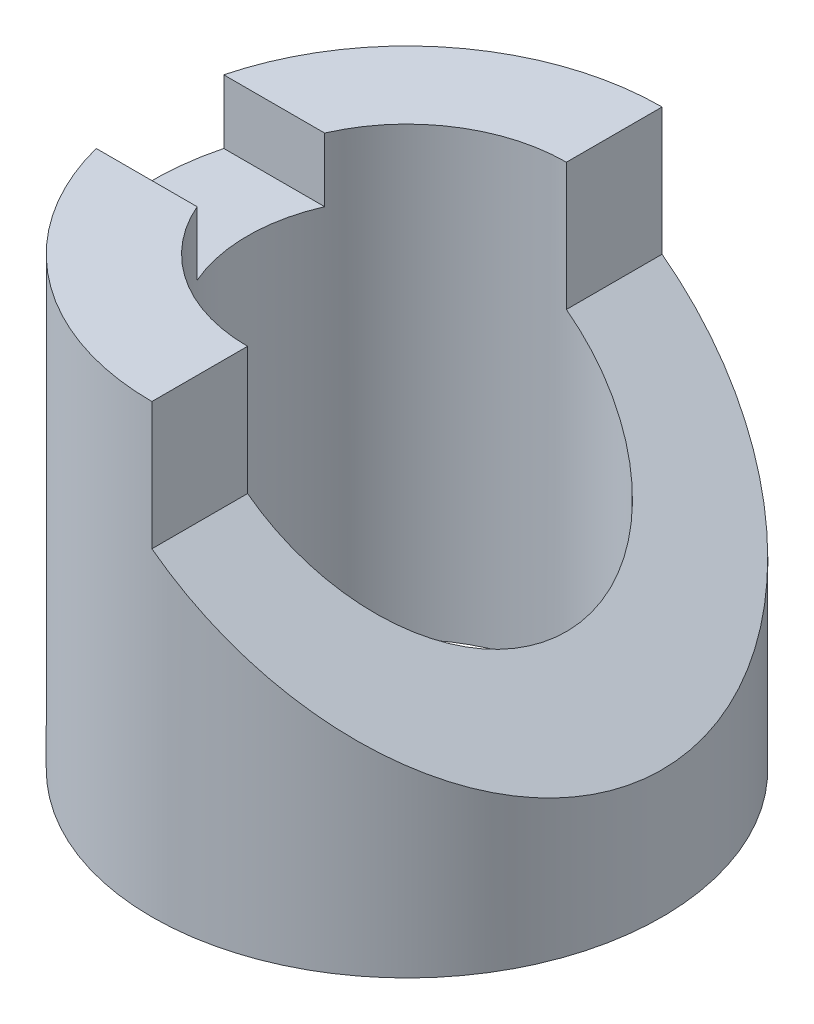
ISO-10303-21;
HEADER;
FILE_DESCRIPTION(('STEP AP214'),'2;1');
FILE_NAME('part.step','',(''),(''),'','','');
FILE_SCHEMA(('AUTOMOTIVE_DESIGN { 1 0 10303 214 1 1 1 1 }'));
ENDSEC;
DATA;
#1=APPLICATION_CONTEXT('core data for automotive mechanical design processes');
#2=APPLICATION_PROTOCOL_DEFINITION('international standard','automotive_design',2000,#1);
#3=PRODUCT_CONTEXT('',#1,'mechanical');
#4=PRODUCT('Part','Part','',(#3));
#5=PRODUCT_RELATED_PRODUCT_CATEGORY('part','',(#4));
#6=PRODUCT_DEFINITION_FORMATION('','',#4);
#7=PRODUCT_DEFINITION_CONTEXT('part definition',#1,'design');
#8=PRODUCT_DEFINITION('design','',#6,#7);
#9=PRODUCT_DEFINITION_SHAPE('','',#8);
#10=(LENGTH_UNIT() NAMED_UNIT(*) SI_UNIT(.MILLI.,.METRE.));
#11=(NAMED_UNIT(*) PLANE_ANGLE_UNIT() SI_UNIT($,.RADIAN.));
#12=(NAMED_UNIT(*) SI_UNIT($,.STERADIAN.) SOLID_ANGLE_UNIT());
#13=UNCERTAINTY_MEASURE_WITH_UNIT(LENGTH_MEASURE(1.E-05),#10,'distance_accuracy_value','');
#14=(GEOMETRIC_REPRESENTATION_CONTEXT(3) GLOBAL_UNCERTAINTY_ASSIGNED_CONTEXT((#13)) GLOBAL_UNIT_ASSIGNED_CONTEXT((#10,
#11,#12)) REPRESENTATION_CONTEXT('',''));
#15=CARTESIAN_POINT('',(0.,0.,0.));
#16=DIRECTION('',(0.,0.,1.));
#17=DIRECTION('',(1.,0.,0.));
#18=AXIS2_PLACEMENT_3D('',#15,#16,#17);
#19=CARTESIAN_POINT('',(0.,70.,0.));
#20=DIRECTION('',(0.,1.,0.));
#21=DIRECTION('',(0.,0.,1.));
#22=AXIS2_PLACEMENT_3D('',#19,#20,#21);
#23=PLANE('',#22);
#24=CARTESIAN_POINT('',(0.,70.,0.));
#25=DIRECTION('',(0.,1.,0.));
#26=DIRECTION('',(0.,0.,1.));
#27=AXIS2_PLACEMENT_3D('',#24,#25,#26);
#28=CIRCLE('',#27,40.);
#29=CARTESIAN_POINT('',(0.,70.,-40.));
#30=VERTEX_POINT('',#29);
#31=CARTESIAN_POINT('',(-38.7298334620742,70.,-10.));
#32=VERTEX_POINT('',#31);
#33=EDGE_CURVE('E119',#30,#32,#28,.T.);
#34=ORIENTED_EDGE('',*,*,#33,.T.);
#35=DIRECTION('',(1.,0.,0.));
#36=VECTOR('',#35,1.);
#37=CARTESIAN_POINT('',(-70.,70.,-10.));
#38=LINE('',#37,#36);
#39=CARTESIAN_POINT('',(-22.9128784747792,70.,-10.));
#40=VERTEX_POINT('',#39);
#41=EDGE_CURVE('E105',#32,#40,#38,.T.);
#42=ORIENTED_EDGE('',*,*,#41,.T.);
#43=CARTESIAN_POINT('',(0.,70.,0.));
#44=DIRECTION('',(0.,1.,0.));
#45=DIRECTION('',(0.,0.,1.));
#46=AXIS2_PLACEMENT_3D('',#43,#44,#45);
#47=CIRCLE('',#46,25.);
#48=CARTESIAN_POINT('',(0.,70.,-25.));
#49=VERTEX_POINT('',#48);
#50=EDGE_CURVE('E125',#49,#40,#47,.T.);
#51=ORIENTED_EDGE('',*,*,#50,.F.);
#52=DIRECTION('',(0.,0.,-1.));
#53=VECTOR('',#52,1.);
#54=CARTESIAN_POINT('',(0.,70.,70.));
#55=LINE('',#54,#53);
#56=EDGE_CURVE('E161',#49,#30,#55,.T.);
#57=ORIENTED_EDGE('',*,*,#56,.T.);
#58=EDGE_LOOP('',(#34,#42,#51,#57));
#59=FACE_BOUND('',#58,.T.);
#60=ADVANCED_FACE('F33',(#59),#23,.T.);
#61=CARTESIAN_POINT('',(-22.9128784747792,70.,10.));
#62=VERTEX_POINT('',#61);
#63=CARTESIAN_POINT('',(0.,70.,25.));
#64=VERTEX_POINT('',#63);
#65=EDGE_CURVE('E113',#62,#64,#47,.T.);
#66=ORIENTED_EDGE('',*,*,#65,.F.);
#67=DIRECTION('',(1.,0.,0.));
#68=VECTOR('',#67,1.);
#69=CARTESIAN_POINT('',(-70.,70.,10.));
#70=LINE('',#69,#68);
#71=CARTESIAN_POINT('',(-38.7298334620742,70.,10.));
#72=VERTEX_POINT('',#71);
#73=EDGE_CURVE('E48',#72,#62,#70,.T.);
#74=ORIENTED_EDGE('',*,*,#73,.F.);
#75=CARTESIAN_POINT('',(0.,70.,40.));
#76=VERTEX_POINT('',#75);
#77=EDGE_CURVE('E111',#72,#76,#28,.T.);
#78=ORIENTED_EDGE('',*,*,#77,.T.);
#79=EDGE_CURVE('E164',#76,#64,#55,.T.);
#80=ORIENTED_EDGE('',*,*,#79,.T.);
#81=EDGE_LOOP('',(#66,#74,#78,#80));
#82=FACE_BOUND('',#81,.T.);
#83=ADVANCED_FACE('F109',(#82),#23,.T.);
#84=CARTESIAN_POINT('',(0.,70.,0.));
#85=DIRECTION('',(0.,-1.,0.));
#86=DIRECTION('',(0.,0.,-1.));
#87=AXIS2_PLACEMENT_3D('',#84,#85,#86);
#88=CYLINDRICAL_SURFACE('',#87,40.);
#89=CARTESIAN_POINT('',(0.,0.,0.));
#90=DIRECTION('',(0.,1.,0.));
#91=DIRECTION('',(0.,0.,1.));
#92=AXIS2_PLACEMENT_3D('',#89,#90,#91);
#93=CIRCLE('',#92,40.);
#94=CARTESIAN_POINT('',(0.,0.,40.));
#95=VERTEX_POINT('',#94);
#96=EDGE_CURVE('E120',#95,#95,#93,.T.);
#97=ORIENTED_EDGE('',*,*,#96,.T.);
#98=EDGE_LOOP('',(#97));
#99=FACE_BOUND('',#98,.T.);
#100=DIRECTION('',(0.,-1.,0.));
#101=VECTOR('',#100,1.);
#102=CARTESIAN_POINT('',(-38.7298334620742,70.,-10.));
#103=LINE('',#102,#101);
#104=CARTESIAN_POINT('',(-38.7298334620742,60.,-10.));
#105=VERTEX_POINT('',#104);
#106=EDGE_CURVE('E152',#32,#105,#103,.T.);
#107=ORIENTED_EDGE('',*,*,#106,.F.);
#108=ORIENTED_EDGE('',*,*,#33,.F.);
#109=DIRECTION('',(0.,-1.,0.));
#110=VECTOR('',#109,1.);
#111=CARTESIAN_POINT('',(0.,70.,-40.));
#112=LINE('',#111,#110);
#113=CARTESIAN_POINT('',(0.,50.,-40.));
#114=VERTEX_POINT('',#113);
#115=EDGE_CURVE('E167',#114,#30,#112,.F.);
#116=ORIENTED_EDGE('',*,*,#115,.F.);
#117=CARTESIAN_POINT('',(0.,50.,0.));
#118=DIRECTION('',(0.6,0.8,0.));
#119=DIRECTION('',(0.8,-0.6,0.));
#120=AXIS2_PLACEMENT_3D('',#117,#118,#119);
#121=ELLIPSE('',#120,50.,40.);
#122=CARTESIAN_POINT('',(0.,50.,40.));
#123=VERTEX_POINT('',#122);
#124=EDGE_CURVE('E165',#123,#114,#121,.T.);
#125=ORIENTED_EDGE('',*,*,#124,.F.);
#126=DIRECTION('',(0.,-1.,0.));
#127=VECTOR('',#126,1.);
#128=CARTESIAN_POINT('',(0.,70.,40.));
#129=LINE('',#128,#127);
#130=EDGE_CURVE('E118',#76,#123,#129,.T.);
#131=ORIENTED_EDGE('',*,*,#130,.F.);
#132=ORIENTED_EDGE('',*,*,#77,.F.);
#133=DIRECTION('',(0.,-1.,0.));
#134=VECTOR('',#133,1.);
#135=CARTESIAN_POINT('',(-38.7298334620742,70.,10.));
#136=LINE('',#135,#134);
#137=CARTESIAN_POINT('',(-38.7298334620742,60.,10.));
#138=VERTEX_POINT('',#137);
#139=EDGE_CURVE('E97',#138,#72,#136,.F.);
#140=ORIENTED_EDGE('',*,*,#139,.F.);
#141=CARTESIAN_POINT('',(0.,60.,0.));
#142=DIRECTION('',(0.,1.,0.));
#143=DIRECTION('',(0.,0.,1.));
#144=AXIS2_PLACEMENT_3D('',#141,#142,#143);
#145=CIRCLE('',#144,40.);
#146=EDGE_CURVE('E104',#105,#138,#145,.T.);
#147=ORIENTED_EDGE('',*,*,#146,.F.);
#148=EDGE_LOOP('',(#107,#108,#116,#125,#131,#132,#140,#147));
#149=FACE_BOUND('',#148,.T.);
#150=ADVANCED_FACE('F35',(#99,#149),#88,.T.);
#151=CARTESIAN_POINT('',(0.,70.,0.));
#152=DIRECTION('',(0.,-1.,0.));
#153=DIRECTION('',(0.,0.,-1.));
#154=AXIS2_PLACEMENT_3D('',#151,#152,#153);
#155=CYLINDRICAL_SURFACE('',#154,25.);
#156=CARTESIAN_POINT('',(0.,0.,0.));
#157=DIRECTION('',(0.,1.,0.));
#158=DIRECTION('',(0.,0.,1.));
#159=AXIS2_PLACEMENT_3D('',#156,#157,#158);
#160=CIRCLE('',#159,25.);
#161=CARTESIAN_POINT('',(0.,0.,25.));
#162=VERTEX_POINT('',#161);
#163=EDGE_CURVE('E128',#162,#162,#160,.T.);
#164=ORIENTED_EDGE('',*,*,#163,.F.);
#165=EDGE_LOOP('',(#164));
#166=FACE_BOUND('',#165,.T.);
#167=ORIENTED_EDGE('',*,*,#50,.T.);
#168=DIRECTION('',(0.,-1.,0.));
#169=VECTOR('',#168,1.);
#170=CARTESIAN_POINT('',(-22.9128784747792,70.,-10.));
#171=LINE('',#170,#169);
#172=CARTESIAN_POINT('',(-22.9128784747792,60.,-10.));
#173=VERTEX_POINT('',#172);
#174=EDGE_CURVE('E11',#40,#173,#171,.T.);
#175=ORIENTED_EDGE('',*,*,#174,.T.);
#176=CARTESIAN_POINT('',(0.,60.,0.));
#177=DIRECTION('',(0.,1.,0.));
#178=DIRECTION('',(0.,0.,1.));
#179=AXIS2_PLACEMENT_3D('',#176,#177,#178);
#180=CIRCLE('',#179,25.);
#181=CARTESIAN_POINT('',(-22.9128784747792,60.,10.));
#182=VERTEX_POINT('',#181);
#183=EDGE_CURVE('E41',#173,#182,#180,.T.);
#184=ORIENTED_EDGE('',*,*,#183,.T.);
#185=DIRECTION('',(0.,-1.,0.));
#186=VECTOR('',#185,1.);
#187=CARTESIAN_POINT('',(-22.9128784747792,70.,10.));
#188=LINE('',#187,#186);
#189=EDGE_CURVE('E139',#182,#62,#188,.F.);
#190=ORIENTED_EDGE('',*,*,#189,.T.);
#191=ORIENTED_EDGE('',*,*,#65,.T.);
#192=DIRECTION('',(0.,-1.,0.));
#193=VECTOR('',#192,1.);
#194=CARTESIAN_POINT('',(0.,70.,25.));
#195=LINE('',#194,#193);
#196=CARTESIAN_POINT('',(0.,50.,25.));
#197=VERTEX_POINT('',#196);
#198=EDGE_CURVE('E136',#64,#197,#195,.T.);
#199=ORIENTED_EDGE('',*,*,#198,.T.);
#200=CARTESIAN_POINT('',(0.,50.,0.));
#201=DIRECTION('',(0.6,0.8,0.));
#202=DIRECTION('',(0.8,-0.6,0.));
#203=AXIS2_PLACEMENT_3D('',#200,#201,#202);
#204=ELLIPSE('',#203,31.25,25.);
#205=CARTESIAN_POINT('',(0.,50.,-25.));
#206=VERTEX_POINT('',#205);
#207=EDGE_CURVE('E123',#197,#206,#204,.T.);
#208=ORIENTED_EDGE('',*,*,#207,.T.);
#209=DIRECTION('',(0.,-1.,0.));
#210=VECTOR('',#209,1.);
#211=CARTESIAN_POINT('',(0.,70.,-25.));
#212=LINE('',#211,#210);
#213=EDGE_CURVE('E133',#206,#49,#212,.F.);
#214=ORIENTED_EDGE('',*,*,#213,.T.);
#215=EDGE_LOOP('',(#167,#175,#184,#190,#191,#199,#208,#214));
#216=FACE_BOUND('',#215,.T.);
#217=ADVANCED_FACE('F143',(#166,#216),#155,.F.);
#218=CARTESIAN_POINT('',(0.,0.,0.));
#219=DIRECTION('',(0.,1.,0.));
#220=DIRECTION('',(0.,0.,1.));
#221=AXIS2_PLACEMENT_3D('',#218,#219,#220);
#222=PLANE('',#221);
#223=ORIENTED_EDGE('',*,*,#96,.F.);
#224=EDGE_LOOP('',(#223));
#225=FACE_BOUND('',#224,.T.);
#226=ORIENTED_EDGE('',*,*,#163,.T.);
#227=EDGE_LOOP('',(#226));
#228=FACE_BOUND('',#227,.T.);
#229=ADVANCED_FACE('F174',(#225,#228),#222,.F.);
#230=CARTESIAN_POINT('',(0.,70.,70.));
#231=DIRECTION('',(1.,0.,0.));
#232=DIRECTION('',(0.,1.,0.));
#233=AXIS2_PLACEMENT_3D('',#230,#231,#232);
#234=PLANE('',#233);
#235=ORIENTED_EDGE('',*,*,#130,.T.);
#236=DIRECTION('',(0.,0.,-1.));
#237=VECTOR('',#236,1.);
#238=CARTESIAN_POINT('',(0.,50.,70.));
#239=LINE('',#238,#237);
#240=EDGE_CURVE('E160',#123,#197,#239,.T.);
#241=ORIENTED_EDGE('',*,*,#240,.T.);
#242=ORIENTED_EDGE('',*,*,#198,.F.);
#243=ORIENTED_EDGE('',*,*,#79,.F.);
#244=EDGE_LOOP('',(#235,#241,#242,#243));
#245=FACE_BOUND('',#244,.T.);
#246=ADVANCED_FACE('F182',(#245),#234,.T.);
#247=ORIENTED_EDGE('',*,*,#115,.T.);
#248=ORIENTED_EDGE('',*,*,#56,.F.);
#249=ORIENTED_EDGE('',*,*,#213,.F.);
#250=EDGE_CURVE('E56',#206,#114,#239,.T.);
#251=ORIENTED_EDGE('',*,*,#250,.T.);
#252=EDGE_LOOP('',(#247,#248,#249,#251));
#253=FACE_BOUND('',#252,.T.);
#254=ADVANCED_FACE('F195',(#253),#234,.T.);
#255=CARTESIAN_POINT('',(0.,50.,70.));
#256=DIRECTION('',(0.6,0.8,0.));
#257=DIRECTION('',(-0.8,0.6,0.));
#258=AXIS2_PLACEMENT_3D('',#255,#256,#257);
#259=PLANE('',#258);
#260=ORIENTED_EDGE('',*,*,#124,.T.);
#261=ORIENTED_EDGE('',*,*,#250,.F.);
#262=ORIENTED_EDGE('',*,*,#207,.F.);
#263=ORIENTED_EDGE('',*,*,#240,.F.);
#264=EDGE_LOOP('',(#260,#261,#262,#263));
#265=FACE_BOUND('',#264,.T.);
#266=ADVANCED_FACE('F198',(#265),#259,.T.);
#267=CARTESIAN_POINT('',(-70.,0.,-9.99999999999999));
#268=DIRECTION('',(0.,0.,1.));
#269=DIRECTION('',(0.,-1.,0.));
#270=AXIS2_PLACEMENT_3D('',#267,#268,#269);
#271=PLANE('',#270);
#272=ORIENTED_EDGE('',*,*,#106,.T.);
#273=DIRECTION('',(1.,0.,0.));
#274=VECTOR('',#273,1.);
#275=CARTESIAN_POINT('',(-70.,60.,-10.));
#276=LINE('',#275,#274);
#277=EDGE_CURVE('E148',#105,#173,#276,.T.);
#278=ORIENTED_EDGE('',*,*,#277,.T.);
#279=ORIENTED_EDGE('',*,*,#174,.F.);
#280=ORIENTED_EDGE('',*,*,#41,.F.);
#281=EDGE_LOOP('',(#272,#278,#279,#280));
#282=FACE_BOUND('',#281,.T.);
#283=ADVANCED_FACE('F150',(#282),#271,.T.);
#284=CARTESIAN_POINT('',(-70.,60.,0.));
#285=DIRECTION('',(0.,1.,0.));
#286=DIRECTION('',(0.,0.,1.));
#287=AXIS2_PLACEMENT_3D('',#284,#285,#286);
#288=PLANE('',#287);
#289=ORIENTED_EDGE('',*,*,#146,.T.);
#290=DIRECTION('',(1.,0.,0.));
#291=VECTOR('',#290,1.);
#292=CARTESIAN_POINT('',(-70.,60.,10.));
#293=LINE('',#292,#291);
#294=EDGE_CURVE('E100',#138,#182,#293,.T.);
#295=ORIENTED_EDGE('',*,*,#294,.T.);
#296=ORIENTED_EDGE('',*,*,#183,.F.);
#297=ORIENTED_EDGE('',*,*,#277,.F.);
#298=EDGE_LOOP('',(#289,#295,#296,#297));
#299=FACE_BOUND('',#298,.T.);
#300=ADVANCED_FACE('F147',(#299),#288,.T.);
#301=CARTESIAN_POINT('',(-70.,0.,9.99999999999999));
#302=DIRECTION('',(0.,0.,-1.));
#303=DIRECTION('',(0.,1.,0.));
#304=AXIS2_PLACEMENT_3D('',#301,#302,#303);
#305=PLANE('',#304);
#306=ORIENTED_EDGE('',*,*,#139,.T.);
#307=ORIENTED_EDGE('',*,*,#73,.T.);
#308=ORIENTED_EDGE('',*,*,#189,.F.);
#309=ORIENTED_EDGE('',*,*,#294,.F.);
#310=EDGE_LOOP('',(#306,#307,#308,#309));
#311=FACE_BOUND('',#310,.T.);
#312=ADVANCED_FACE('F98',(#311),#305,.T.);
#313=CLOSED_SHELL('',(#60,#83,#150,#217,#229,#246,#254,#266,#283,#300,#312));
#314=MANIFOLD_SOLID_BREP('B2',#313);
#315=ADVANCED_BREP_SHAPE_REPRESENTATION('',(#18,#314),#14);
#316=SHAPE_DEFINITION_REPRESENTATION(#9,#315);
ENDSEC;
END-ISO-10303-21;
